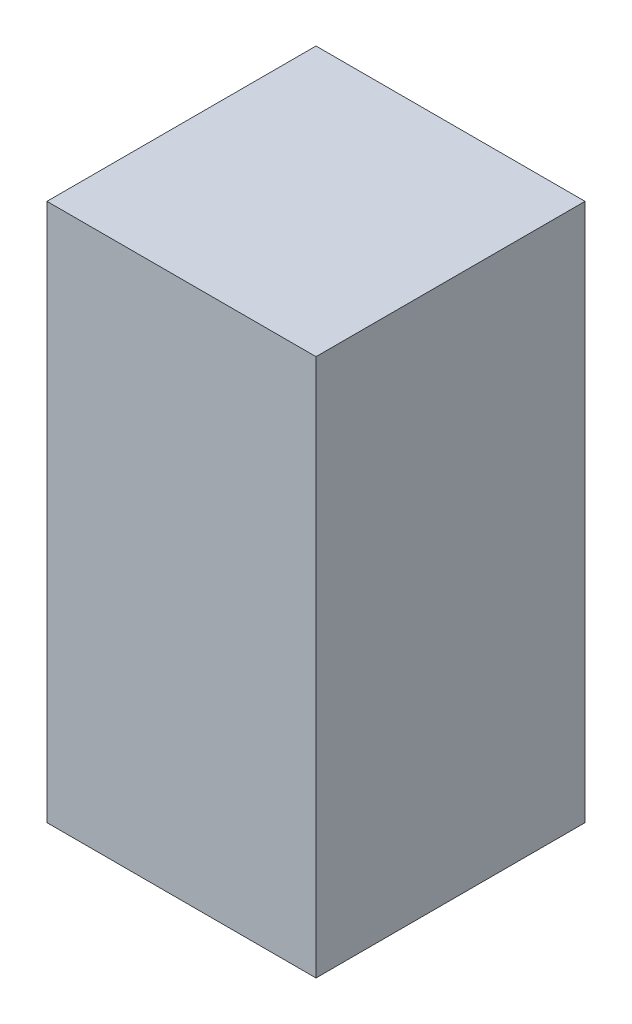
ISO-10303-21;
HEADER;
FILE_DESCRIPTION(('STEP AP214'),'2;1');
FILE_NAME('part.step','',(''),(''),'','','');
FILE_SCHEMA(('AUTOMOTIVE_DESIGN { 1 0 10303 214 1 1 1 1 }'));
ENDSEC;
DATA;
#1=APPLICATION_CONTEXT('core data for automotive mechanical design processes');
#2=APPLICATION_PROTOCOL_DEFINITION('international standard','automotive_design',2000,#1);
#3=PRODUCT_CONTEXT('',#1,'mechanical');
#4=PRODUCT('Part','Part','',(#3));
#5=PRODUCT_RELATED_PRODUCT_CATEGORY('part','',(#4));
#6=PRODUCT_DEFINITION_FORMATION('','',#4);
#7=PRODUCT_DEFINITION_CONTEXT('part definition',#1,'design');
#8=PRODUCT_DEFINITION('design','',#6,#7);
#9=PRODUCT_DEFINITION_SHAPE('','',#8);
#10=(LENGTH_UNIT() NAMED_UNIT(*) SI_UNIT(.MILLI.,.METRE.));
#11=(NAMED_UNIT(*) PLANE_ANGLE_UNIT() SI_UNIT($,.RADIAN.));
#12=(NAMED_UNIT(*) SI_UNIT($,.STERADIAN.) SOLID_ANGLE_UNIT());
#13=UNCERTAINTY_MEASURE_WITH_UNIT(LENGTH_MEASURE(1.E-05),#10,'distance_accuracy_value','');
#14=(GEOMETRIC_REPRESENTATION_CONTEXT(3) GLOBAL_UNCERTAINTY_ASSIGNED_CONTEXT((#13)) GLOBAL_UNIT_ASSIGNED_CONTEXT((#10,
#11,#12)) REPRESENTATION_CONTEXT('',''));
#15=CARTESIAN_POINT('',(0.,0.,0.));
#16=DIRECTION('',(0.,0.,1.));
#17=DIRECTION('',(1.,0.,0.));
#18=AXIS2_PLACEMENT_3D('',#15,#16,#17);
#19=CARTESIAN_POINT('',(0.,100.,0.));
#20=DIRECTION('',(1.,0.,0.));
#21=DIRECTION('',(0.,0.,-1.));
#22=AXIS2_PLACEMENT_3D('',#19,#20,#21);
#23=PLANE('',#22);
#24=DIRECTION('',(0.,0.,1.));
#25=VECTOR('',#24,1.);
#26=CARTESIAN_POINT('',(0.,0.,0.));
#27=LINE('',#26,#25);
#28=CARTESIAN_POINT('',(0.,0.,-50.));
#29=VERTEX_POINT('',#28);
#30=CARTESIAN_POINT('',(0.,0.,0.));
#31=VERTEX_POINT('',#30);
#32=EDGE_CURVE('E99',#29,#31,#27,.T.);
#33=ORIENTED_EDGE('',*,*,#32,.T.);
#34=DIRECTION('',(0.,-1.,0.));
#35=VECTOR('',#34,1.);
#36=CARTESIAN_POINT('',(0.,100.,0.));
#37=LINE('',#36,#35);
#38=CARTESIAN_POINT('',(0.,100.,0.));
#39=VERTEX_POINT('',#38);
#40=EDGE_CURVE('E11',#39,#31,#37,.T.);
#41=ORIENTED_EDGE('',*,*,#40,.F.);
#42=DIRECTION('',(0.,0.,1.));
#43=VECTOR('',#42,1.);
#44=CARTESIAN_POINT('',(0.,100.,0.));
#45=LINE('',#44,#43);
#46=CARTESIAN_POINT('',(0.,100.,-50.));
#47=VERTEX_POINT('',#46);
#48=EDGE_CURVE('E87',#47,#39,#45,.T.);
#49=ORIENTED_EDGE('',*,*,#48,.F.);
#50=DIRECTION('',(0.,-1.,0.));
#51=VECTOR('',#50,1.);
#52=CARTESIAN_POINT('',(0.,100.,-50.));
#53=LINE('',#52,#51);
#54=EDGE_CURVE('E95',#47,#29,#53,.T.);
#55=ORIENTED_EDGE('',*,*,#54,.T.);
#56=EDGE_LOOP('',(#33,#41,#49,#55));
#57=FACE_BOUND('',#56,.T.);
#58=ADVANCED_FACE('F36',(#57),#23,.F.);
#59=CARTESIAN_POINT('',(0.,100.,0.));
#60=DIRECTION('',(0.,0.,-1.));
#61=DIRECTION('',(-1.,0.,0.));
#62=AXIS2_PLACEMENT_3D('',#59,#60,#61);
#63=PLANE('',#62);
#64=DIRECTION('',(1.,0.,0.));
#65=VECTOR('',#64,1.);
#66=CARTESIAN_POINT('',(0.,0.,0.));
#67=LINE('',#66,#65);
#68=CARTESIAN_POINT('',(50.,0.,0.));
#69=VERTEX_POINT('',#68);
#70=EDGE_CURVE('E91',#31,#69,#67,.T.);
#71=ORIENTED_EDGE('',*,*,#70,.T.);
#72=DIRECTION('',(0.,-1.,0.));
#73=VECTOR('',#72,1.);
#74=CARTESIAN_POINT('',(50.,100.,0.));
#75=LINE('',#74,#73);
#76=CARTESIAN_POINT('',(50.,100.,0.));
#77=VERTEX_POINT('',#76);
#78=EDGE_CURVE('E44',#77,#69,#75,.T.);
#79=ORIENTED_EDGE('',*,*,#78,.F.);
#80=DIRECTION('',(1.,0.,0.));
#81=VECTOR('',#80,1.);
#82=CARTESIAN_POINT('',(0.,100.,0.));
#83=LINE('',#82,#81);
#84=EDGE_CURVE('E82',#39,#77,#83,.T.);
#85=ORIENTED_EDGE('',*,*,#84,.F.);
#86=ORIENTED_EDGE('',*,*,#40,.T.);
#87=EDGE_LOOP('',(#71,#79,#85,#86));
#88=FACE_BOUND('',#87,.T.);
#89=ADVANCED_FACE('F90',(#88),#63,.F.);
#90=CARTESIAN_POINT('',(50.,100.,0.));
#91=DIRECTION('',(-1.,0.,0.));
#92=DIRECTION('',(0.,0.,1.));
#93=AXIS2_PLACEMENT_3D('',#90,#91,#92);
#94=PLANE('',#93);
#95=DIRECTION('',(0.,0.,-1.));
#96=VECTOR('',#95,1.);
#97=CARTESIAN_POINT('',(50.,0.,0.));
#98=LINE('',#97,#96);
#99=CARTESIAN_POINT('',(50.,0.,-50.));
#100=VERTEX_POINT('',#99);
#101=EDGE_CURVE('E69',#69,#100,#98,.T.);
#102=ORIENTED_EDGE('',*,*,#101,.T.);
#103=DIRECTION('',(0.,-1.,0.));
#104=VECTOR('',#103,1.);
#105=CARTESIAN_POINT('',(50.,100.,-50.));
#106=LINE('',#105,#104);
#107=CARTESIAN_POINT('',(50.,100.,-50.));
#108=VERTEX_POINT('',#107);
#109=EDGE_CURVE('E92',#108,#100,#106,.T.);
#110=ORIENTED_EDGE('',*,*,#109,.F.);
#111=DIRECTION('',(0.,0.,-1.));
#112=VECTOR('',#111,1.);
#113=CARTESIAN_POINT('',(50.,100.,0.));
#114=LINE('',#113,#112);
#115=EDGE_CURVE('E85',#77,#108,#114,.T.);
#116=ORIENTED_EDGE('',*,*,#115,.F.);
#117=ORIENTED_EDGE('',*,*,#78,.T.);
#118=EDGE_LOOP('',(#102,#110,#116,#117));
#119=FACE_BOUND('',#118,.T.);
#120=ADVANCED_FACE('F93',(#119),#94,.F.);
#121=CARTESIAN_POINT('',(0.,100.,-50.));
#122=DIRECTION('',(0.,0.,1.));
#123=DIRECTION('',(1.,0.,0.));
#124=AXIS2_PLACEMENT_3D('',#121,#122,#123);
#125=PLANE('',#124);
#126=DIRECTION('',(-1.,0.,0.));
#127=VECTOR('',#126,1.);
#128=CARTESIAN_POINT('',(0.,0.,-50.));
#129=LINE('',#128,#127);
#130=EDGE_CURVE('E75',#100,#29,#129,.T.);
#131=ORIENTED_EDGE('',*,*,#130,.T.);
#132=ORIENTED_EDGE('',*,*,#54,.F.);
#133=DIRECTION('',(-1.,0.,0.));
#134=VECTOR('',#133,1.);
#135=CARTESIAN_POINT('',(0.,100.,-50.));
#136=LINE('',#135,#134);
#137=EDGE_CURVE('E52',#108,#47,#136,.T.);
#138=ORIENTED_EDGE('',*,*,#137,.F.);
#139=ORIENTED_EDGE('',*,*,#109,.T.);
#140=EDGE_LOOP('',(#131,#132,#138,#139));
#141=FACE_BOUND('',#140,.T.);
#142=ADVANCED_FACE('F106',(#141),#125,.F.);
#143=CARTESIAN_POINT('',(0.,100.,0.));
#144=DIRECTION('',(0.,-1.,0.));
#145=DIRECTION('',(0.,0.,-1.));
#146=AXIS2_PLACEMENT_3D('',#143,#144,#145);
#147=PLANE('',#146);
#148=ORIENTED_EDGE('',*,*,#48,.T.);
#149=ORIENTED_EDGE('',*,*,#84,.T.);
#150=ORIENTED_EDGE('',*,*,#115,.T.);
#151=ORIENTED_EDGE('',*,*,#137,.T.);
#152=EDGE_LOOP('',(#148,#149,#150,#151));
#153=FACE_BOUND('',#152,.T.);
#154=ADVANCED_FACE('F83',(#153),#147,.F.);
#155=CARTESIAN_POINT('',(0.,0.,0.));
#156=DIRECTION('',(0.,-1.,0.));
#157=DIRECTION('',(0.,0.,-1.));
#158=AXIS2_PLACEMENT_3D('',#155,#156,#157);
#159=PLANE('',#158);
#160=ORIENTED_EDGE('',*,*,#32,.F.);
#161=ORIENTED_EDGE('',*,*,#130,.F.);
#162=ORIENTED_EDGE('',*,*,#101,.F.);
#163=ORIENTED_EDGE('',*,*,#70,.F.);
#164=EDGE_LOOP('',(#160,#161,#162,#163));
#165=FACE_BOUND('',#164,.T.);
#166=ADVANCED_FACE('F109',(#165),#159,.T.);
#167=CLOSED_SHELL('',(#58,#89,#120,#142,#154,#166));
#168=MANIFOLD_SOLID_BREP('B2',#167);
#169=ADVANCED_BREP_SHAPE_REPRESENTATION('',(#18,#168),#14);
#170=SHAPE_DEFINITION_REPRESENTATION(#9,#169);
ENDSEC;
END-ISO-10303-21;
